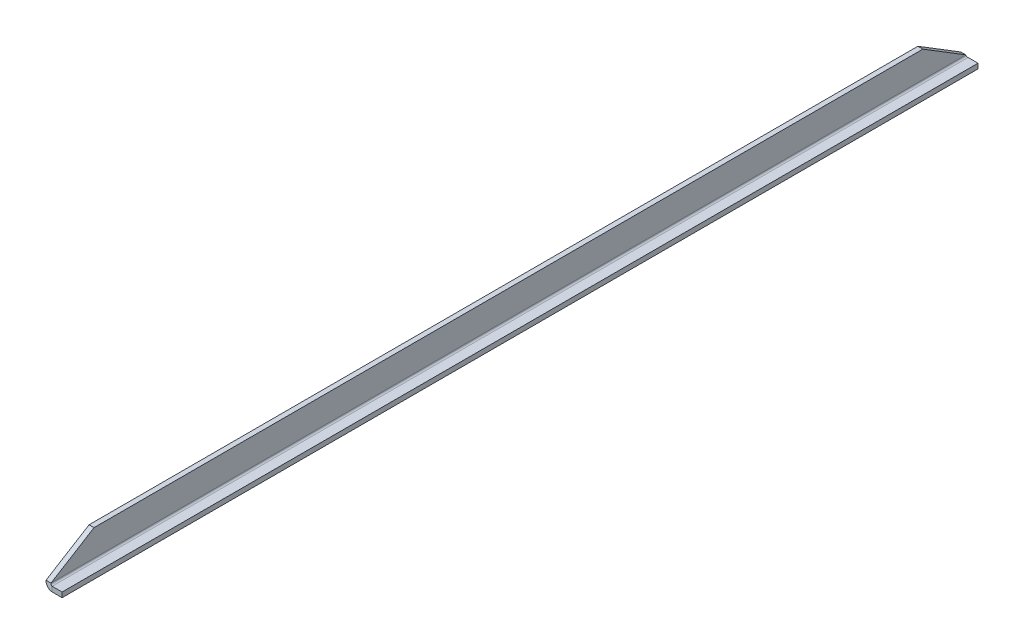
ISO-10303-21;
HEADER;
FILE_DESCRIPTION(('STEP AP214'),'2;1');
FILE_NAME('part.step','',(''),(''),'','','');
FILE_SCHEMA(('AUTOMOTIVE_DESIGN { 1 0 10303 214 1 1 1 1 }'));
ENDSEC;
DATA;
#1=APPLICATION_CONTEXT('core data for automotive mechanical design processes');
#2=APPLICATION_PROTOCOL_DEFINITION('international standard','automotive_design',2000,#1);
#3=PRODUCT_CONTEXT('',#1,'mechanical');
#4=PRODUCT('Part','Part','',(#3));
#5=PRODUCT_RELATED_PRODUCT_CATEGORY('part','',(#4));
#6=PRODUCT_DEFINITION_FORMATION('','',#4);
#7=PRODUCT_DEFINITION_CONTEXT('part definition',#1,'design');
#8=PRODUCT_DEFINITION('design','',#6,#7);
#9=PRODUCT_DEFINITION_SHAPE('','',#8);
#10=(LENGTH_UNIT() NAMED_UNIT(*) SI_UNIT(.MILLI.,.METRE.));
#11=(NAMED_UNIT(*) PLANE_ANGLE_UNIT() SI_UNIT($,.RADIAN.));
#12=(NAMED_UNIT(*) SI_UNIT($,.STERADIAN.) SOLID_ANGLE_UNIT());
#13=UNCERTAINTY_MEASURE_WITH_UNIT(LENGTH_MEASURE(1.E-05),#10,'distance_accuracy_value','');
#14=(GEOMETRIC_REPRESENTATION_CONTEXT(3) GLOBAL_UNCERTAINTY_ASSIGNED_CONTEXT((#13)) GLOBAL_UNIT_ASSIGNED_CONTEXT((#10,
#11,#12)) REPRESENTATION_CONTEXT('',''));
#15=CARTESIAN_POINT('',(0.,0.,0.));
#16=DIRECTION('',(0.,0.,1.));
#17=DIRECTION('',(1.,0.,0.));
#18=AXIS2_PLACEMENT_3D('',#15,#16,#17);
#19=CARTESIAN_POINT('',(-1167.,-730.000000000004,579.999999999999));
#20=DIRECTION('',(0.,1.,0.));
#21=DIRECTION('',(-1.,0.,0.));
#22=AXIS2_PLACEMENT_3D('',#19,#20,#21);
#23=PLANE('',#22);
#24=DIRECTION('',(0.,0.,1.));
#25=VECTOR('',#24,1.);
#26=CARTESIAN_POINT('',(-1160.,-730.000000000004,579.999999999999));
#27=LINE('',#26,#25);
#28=CARTESIAN_POINT('',(-1160.,-730.000000000003,856.292893218813));
#29=VERTEX_POINT('',#28);
#30=CARTESIAN_POINT('',(-1160.,-730.000000000004,303.707106781185));
#31=VERTEX_POINT('',#30);
#32=EDGE_CURVE('E203',#29,#31,#27,.F.);
#33=ORIENTED_EDGE('',*,*,#32,.F.);
#34=DIRECTION('',(-1.,0.,0.));
#35=VECTOR('',#34,1.);
#36=CARTESIAN_POINT('',(-1167.,-730.000000000003,856.292893218813));
#37=LINE('',#36,#35);
#38=CARTESIAN_POINT('',(-1166.,-730.000000000001,856.292893218813));
#39=VERTEX_POINT('',#38);
#40=EDGE_CURVE('E394',#39,#29,#37,.F.);
#41=ORIENTED_EDGE('',*,*,#40,.F.);
#42=DIRECTION('',(0.,0.,1.));
#43=VECTOR('',#42,1.);
#44=CARTESIAN_POINT('',(-1166.,-730.000000000003,856.292893218813));
#45=LINE('',#44,#43);
#46=CARTESIAN_POINT('',(-1166.,-730.000000000032,303.707106781185));
#47=VERTEX_POINT('',#46);
#48=EDGE_CURVE('E178',#47,#39,#45,.T.);
#49=ORIENTED_EDGE('',*,*,#48,.F.);
#50=DIRECTION('',(-1.,0.,0.));
#51=VECTOR('',#50,1.);
#52=CARTESIAN_POINT('',(-1167.,-730.000000000004,303.707106781185));
#53=LINE('',#52,#51);
#54=EDGE_CURVE('E400',#31,#47,#53,.T.);
#55=ORIENTED_EDGE('',*,*,#54,.F.);
#56=EDGE_LOOP('',(#33,#41,#49,#55));
#57=FACE_BOUND('',#56,.T.);
#58=ADVANCED_FACE('F59',(#57),#23,.F.);
#59=CARTESIAN_POINT('',(-1167.,378.236719210667,856.29289321881));
#60=DIRECTION('',(0.,0.,-1.));
#61=DIRECTION('',(-1.,0.,0.));
#62=AXIS2_PLACEMENT_3D('',#59,#60,#61);
#63=PLANE('',#62);
#64=CARTESIAN_POINT('',(-1166.,-730.000000000002,856.292893218813));
#65=CARTESIAN_POINT('',(-1166.,-727.000000000001,856.292893218813));
#66=B_SPLINE_CURVE_WITH_KNOTS('',1,(#64,#65),.UNSPECIFIED.,.F.,.F.,(2,2),(0.,1.),.UNSPECIFIED.);
#67=CARTESIAN_POINT('',(-1166.,-727.000000000003,856.292893218813));
#68=VERTEX_POINT('',#67);
#69=EDGE_CURVE('E413',#68,#39,#66,.F.);
#70=ORIENTED_EDGE('',*,*,#69,.T.);
#71=ORIENTED_EDGE('',*,*,#40,.T.);
#72=DIRECTION('',(0.,-1.,0.));
#73=VECTOR('',#72,1.);
#74=CARTESIAN_POINT('',(-1160.,378.236719210667,856.29289321881));
#75=LINE('',#74,#73);
#76=CARTESIAN_POINT('',(-1160.,-727.000000000001,856.292893218813));
#77=VERTEX_POINT('',#76);
#78=EDGE_CURVE('E14',#77,#29,#75,.T.);
#79=ORIENTED_EDGE('',*,*,#78,.F.);
#80=DIRECTION('',(-1.,0.,0.));
#81=VECTOR('',#80,1.);
#82=CARTESIAN_POINT('',(-1167.,-727.000000000003,856.292893218813));
#83=LINE('',#82,#81);
#84=EDGE_CURVE('E404',#68,#77,#83,.F.);
#85=ORIENTED_EDGE('',*,*,#84,.F.);
#86=EDGE_LOOP('',(#70,#71,#79,#85));
#87=FACE_BOUND('',#86,.T.);
#88=ADVANCED_FACE('F61',(#87),#63,.F.);
#89=CARTESIAN_POINT('',(-1160.,378.236719210665,299.999999999996));
#90=DIRECTION('',(1.,0.,0.));
#91=DIRECTION('',(0.,0.,-1.));
#92=AXIS2_PLACEMENT_3D('',#89,#90,#91);
#93=PLANE('',#92);
#94=ORIENTED_EDGE('',*,*,#32,.T.);
#95=DIRECTION('',(0.,-1.,0.));
#96=VECTOR('',#95,1.);
#97=CARTESIAN_POINT('',(-1160.,378.236719210665,303.707106781182));
#98=LINE('',#97,#96);
#99=CARTESIAN_POINT('',(-1160.,-727.000000000004,303.707106781185));
#100=VERTEX_POINT('',#99);
#101=EDGE_CURVE('E71',#100,#31,#98,.T.);
#102=ORIENTED_EDGE('',*,*,#101,.F.);
#103=DIRECTION('',(0.,0.,1.));
#104=VECTOR('',#103,1.);
#105=CARTESIAN_POINT('',(-1160.,-727.000000000004,299.999999999998));
#106=LINE('',#105,#104);
#107=EDGE_CURVE('E80',#100,#77,#106,.T.);
#108=ORIENTED_EDGE('',*,*,#107,.T.);
#109=ORIENTED_EDGE('',*,*,#78,.T.);
#110=EDGE_LOOP('',(#94,#102,#108,#109));
#111=FACE_BOUND('',#110,.T.);
#112=ADVANCED_FACE('F443',(#111),#93,.T.);
#113=CARTESIAN_POINT('',(-1167.,378.236719210664,303.707106781182));
#114=DIRECTION('',(0.,0.,-1.));
#115=DIRECTION('',(-1.,0.,0.));
#116=AXIS2_PLACEMENT_3D('',#113,#114,#115);
#117=PLANE('',#116);
#118=ORIENTED_EDGE('',*,*,#54,.T.);
#119=CARTESIAN_POINT('',(-1166.,-727.000000000005,303.707106781185));
#120=CARTESIAN_POINT('',(-1166.,-730.000000000005,303.707106781185));
#121=B_SPLINE_CURVE_WITH_KNOTS('',1,(#119,#120),.UNSPECIFIED.,.F.,.F.,(2,2),(0.,1.),.UNSPECIFIED.);
#122=CARTESIAN_POINT('',(-1166.,-727.000000000032,303.707106781185));
#123=VERTEX_POINT('',#122);
#124=EDGE_CURVE('E416',#123,#47,#121,.T.);
#125=ORIENTED_EDGE('',*,*,#124,.F.);
#126=DIRECTION('',(-1.,0.,0.));
#127=VECTOR('',#126,1.);
#128=CARTESIAN_POINT('',(-1167.,-727.000000000004,303.707106781185));
#129=LINE('',#128,#127);
#130=EDGE_CURVE('E90',#123,#100,#129,.F.);
#131=ORIENTED_EDGE('',*,*,#130,.T.);
#132=ORIENTED_EDGE('',*,*,#101,.T.);
#133=EDGE_LOOP('',(#118,#125,#131,#132));
#134=FACE_BOUND('',#133,.T.);
#135=ADVANCED_FACE('F433',(#134),#117,.T.);
#136=CARTESIAN_POINT('',(-1167.,-727.000000000004,579.999999999999));
#137=DIRECTION('',(0.,1.,0.));
#138=DIRECTION('',(-1.,0.,0.));
#139=AXIS2_PLACEMENT_3D('',#136,#137,#138);
#140=PLANE('',#139);
#141=ORIENTED_EDGE('',*,*,#84,.T.);
#142=ORIENTED_EDGE('',*,*,#107,.F.);
#143=ORIENTED_EDGE('',*,*,#130,.F.);
#144=DIRECTION('',(0.,0.,1.));
#145=VECTOR('',#144,1.);
#146=CARTESIAN_POINT('',(-1166.,-727.000000000003,856.292893218813));
#147=LINE('',#146,#145);
#148=EDGE_CURVE('E342',#123,#68,#147,.T.);
#149=ORIENTED_EDGE('',*,*,#148,.T.);
#150=EDGE_LOOP('',(#141,#142,#143,#149));
#151=FACE_BOUND('',#150,.T.);
#152=ADVANCED_FACE('F442',(#151),#140,.T.);
#153=CARTESIAN_POINT('',(-62.5363292529752,-710.,829.999999999999));
#154=DIRECTION('',(0.,-1.,0.));
#155=DIRECTION('',(1.,0.,0.));
#156=AXIS2_PLACEMENT_3D('',#153,#154,#155);
#157=PLANE('',#156);
#158=DIRECTION('',(0.,0.,1.));
#159=VECTOR('',#158,1.);
#160=CARTESIAN_POINT('',(-1170.,-710.,579.999999999999));
#161=LINE('',#160,#159);
#162=CARTESIAN_POINT('',(-1170.,-710.,829.999999999999));
#163=VERTEX_POINT('',#162);
#164=CARTESIAN_POINT('',(-1170.,-710.,329.999999999999));
#165=VERTEX_POINT('',#164);
#166=EDGE_CURVE('E227',#163,#165,#161,.F.);
#167=ORIENTED_EDGE('',*,*,#166,.F.);
#168=DIRECTION('',(-1.,0.,0.));
#169=VECTOR('',#168,1.);
#170=CARTESIAN_POINT('',(-62.5363292529752,-710.,829.999999999999));
#171=LINE('',#170,#169);
#172=CARTESIAN_POINT('',(-1167.,-710.,829.999999999999));
#173=VERTEX_POINT('',#172);
#174=EDGE_CURVE('E196',#173,#163,#171,.T.);
#175=ORIENTED_EDGE('',*,*,#174,.F.);
#176=DIRECTION('',(0.,0.,1.));
#177=VECTOR('',#176,1.);
#178=CARTESIAN_POINT('',(-1167.,-710.,829.999999999999));
#179=LINE('',#178,#177);
#180=CARTESIAN_POINT('',(-1167.,-710.,329.999999999999));
#181=VERTEX_POINT('',#180);
#182=EDGE_CURVE('E221',#181,#173,#179,.T.);
#183=ORIENTED_EDGE('',*,*,#182,.F.);
#184=DIRECTION('',(-1.,0.,0.));
#185=VECTOR('',#184,1.);
#186=CARTESIAN_POINT('',(-62.5363292529748,-710.,329.999999999998));
#187=LINE('',#186,#185);
#188=EDGE_CURVE('E165',#181,#165,#187,.T.);
#189=ORIENTED_EDGE('',*,*,#188,.T.);
#190=EDGE_LOOP('',(#167,#175,#183,#189));
#191=FACE_BOUND('',#190,.T.);
#192=ADVANCED_FACE('F474',(#191),#157,.F.);
#193=CARTESIAN_POINT('',(-1167.,-710.,329.999999999999));
#194=DIRECTION('',(1.,0.,0.));
#195=DIRECTION('',(0.,0.,-1.));
#196=AXIS2_PLACEMENT_3D('',#193,#194,#195);
#197=PLANE('',#196);
#198=DIRECTION('',(0.,-0.524097425664204,-0.851658316704624));
#199=VECTOR('',#198,1.);
#200=CARTESIAN_POINT('',(-1167.,-381.416309013001,863.948497854056));
#201=LINE('',#200,#199);
#202=CARTESIAN_POINT('',(-1167.,-726.000000000004,304.));
#203=VERTEX_POINT('',#202);
#204=EDGE_CURVE('E337',#181,#203,#201,.T.);
#205=ORIENTED_EDGE('',*,*,#204,.F.);
#206=ORIENTED_EDGE('',*,*,#182,.T.);
#207=DIRECTION('',(0.,-0.524097425664304,0.851658316704563));
#208=VECTOR('',#207,1.);
#209=CARTESIAN_POINT('',(-1167.,-381.416309012905,296.051502145927));
#210=LINE('',#209,#208);
#211=CARTESIAN_POINT('',(-1167.,-726.000000000001,855.999999999999));
#212=VERTEX_POINT('',#211);
#213=EDGE_CURVE('E226',#173,#212,#210,.T.);
#214=ORIENTED_EDGE('',*,*,#213,.T.);
#215=DIRECTION('',(0.,0.,1.));
#216=VECTOR('',#215,1.);
#217=CARTESIAN_POINT('',(-1167.,-726.000000000003,579.999999999999));
#218=LINE('',#217,#216);
#219=EDGE_CURVE('E166',#203,#212,#218,.T.);
#220=ORIENTED_EDGE('',*,*,#219,.F.);
#221=EDGE_LOOP('',(#205,#206,#214,#220));
#222=FACE_BOUND('',#221,.T.);
#223=ADVANCED_FACE('F345',(#222),#197,.T.);
#224=CARTESIAN_POINT('',(-62.5363292529748,-381.416309013001,863.948497854056));
#225=DIRECTION('',(0.,0.851658316704624,-0.524097425664204));
#226=DIRECTION('',(0.,0.524097425664204,0.851658316704624));
#227=AXIS2_PLACEMENT_3D('',#224,#225,#226);
#228=PLANE('',#227);
#229=CARTESIAN_POINT('',(-1170.,-726.000000000004,304.));
#230=CARTESIAN_POINT('',(-1167.,-726.000000000004,304.));
#231=B_SPLINE_CURVE_WITH_KNOTS('',1,(#229,#230),.UNSPECIFIED.,.F.,.F.,(2,2),(0.,1.),.UNSPECIFIED.);
#232=CARTESIAN_POINT('',(-1170.,-726.000000000004,304.000000000001));
#233=VERTEX_POINT('',#232);
#234=EDGE_CURVE('E324',#203,#233,#231,.F.);
#235=ORIENTED_EDGE('',*,*,#234,.T.);
#236=DIRECTION('',(0.,-0.524097425664204,-0.851658316704624));
#237=VECTOR('',#236,1.);
#238=CARTESIAN_POINT('',(-1170.,-381.416309013001,863.948497854056));
#239=LINE('',#238,#237);
#240=EDGE_CURVE('E189',#165,#233,#239,.T.);
#241=ORIENTED_EDGE('',*,*,#240,.F.);
#242=ORIENTED_EDGE('',*,*,#188,.F.);
#243=ORIENTED_EDGE('',*,*,#204,.T.);
#244=EDGE_LOOP('',(#235,#241,#242,#243));
#245=FACE_BOUND('',#244,.T.);
#246=ADVANCED_FACE('F350',(#245),#228,.T.);
#247=CARTESIAN_POINT('',(-1170.,80.0000000000003,579.999999999999));
#248=DIRECTION('',(-1.,0.,0.));
#249=DIRECTION('',(0.,0.,1.));
#250=AXIS2_PLACEMENT_3D('',#247,#248,#249);
#251=PLANE('',#250);
#252=ORIENTED_EDGE('',*,*,#166,.T.);
#253=ORIENTED_EDGE('',*,*,#240,.T.);
#254=DIRECTION('',(0.,0.,1.));
#255=VECTOR('',#254,1.);
#256=CARTESIAN_POINT('',(-1170.,-725.999999999997,579.999999999999));
#257=LINE('',#256,#255);
#258=CARTESIAN_POINT('',(-1170.,-726.000000000001,855.999999999999));
#259=VERTEX_POINT('',#258);
#260=EDGE_CURVE('E176',#233,#259,#257,.T.);
#261=ORIENTED_EDGE('',*,*,#260,.T.);
#262=DIRECTION('',(0.,-0.524097425664304,0.851658316704563));
#263=VECTOR('',#262,1.);
#264=CARTESIAN_POINT('',(-1170.,-381.416309012905,296.051502145927));
#265=LINE('',#264,#263);
#266=EDGE_CURVE('E186',#163,#259,#265,.T.);
#267=ORIENTED_EDGE('',*,*,#266,.F.);
#268=EDGE_LOOP('',(#252,#253,#261,#267));
#269=FACE_BOUND('',#268,.T.);
#270=ADVANCED_FACE('F185',(#269),#251,.T.);
#271=CARTESIAN_POINT('',(-62.5363292529748,-381.416309012905,296.051502145926));
#272=DIRECTION('',(0.,-0.851658316704563,-0.524097425664304));
#273=DIRECTION('',(0.,0.524097425664304,-0.851658316704563));
#274=AXIS2_PLACEMENT_3D('',#271,#272,#273);
#275=PLANE('',#274);
#276=ORIENTED_EDGE('',*,*,#266,.T.);
#277=CARTESIAN_POINT('',(-1167.,-726.000000000001,855.999999999999));
#278=CARTESIAN_POINT('',(-1170.,-726.000000000001,855.999999999999));
#279=B_SPLINE_CURVE_WITH_KNOTS('',1,(#277,#278),.UNSPECIFIED.,.F.,.F.,(2,2),(0.,1.),.UNSPECIFIED.);
#280=EDGE_CURVE('E149',#212,#259,#279,.T.);
#281=ORIENTED_EDGE('',*,*,#280,.F.);
#282=ORIENTED_EDGE('',*,*,#213,.F.);
#283=ORIENTED_EDGE('',*,*,#174,.T.);
#284=EDGE_LOOP('',(#276,#281,#282,#283));
#285=FACE_BOUND('',#284,.T.);
#286=ADVANCED_FACE('F194',(#285),#275,.F.);
#287=CARTESIAN_POINT('',(-1170.,-726.000000000004,304.));
#288=CARTESIAN_POINT('',(-1170.,-726.523692974342,303.975587840653));
#289=CARTESIAN_POINT('',(-1169.89589070667,-727.046991537441,303.951184463531));
#290=CARTESIAN_POINT('',(-1169.49514555342,-728.014475921487,303.902368927062));
#291=CARTESIAN_POINT('',(-1169.19866736959,-728.458186879903,303.877961158827));
#292=CARTESIAN_POINT('',(-1168.4581868799,-729.198667369596,303.829145622358));
#293=CARTESIAN_POINT('',(-1168.01447592149,-729.49514555342,303.804737854124));
#294=CARTESIAN_POINT('',(-1167.04699153744,-729.895890706677,303.755922317654));
#295=CARTESIAN_POINT('',(-1166.52369297434,-730.000000000004,303.731518940532));
#296=CARTESIAN_POINT('',(-1166.,-730.000000000005,303.707106781185));
#297=CARTESIAN_POINT('',(-1167.,-726.000000000004,304.));
#298=CARTESIAN_POINT('',(-1167.,-726.13092250178,303.975587978972));
#299=CARTESIAN_POINT('',(-1166.97397267667,-726.261747884363,303.951184463531));
#300=CARTESIAN_POINT('',(-1166.87378638835,-726.503618980375,303.902368927062));
#301=CARTESIAN_POINT('',(-1166.7996668424,-726.614546719979,303.877961158827));
#302=CARTESIAN_POINT('',(-1166.61454671998,-726.799666842402,303.829145622358));
#303=CARTESIAN_POINT('',(-1166.50361898037,-726.873786388358,303.804737854124));
#304=CARTESIAN_POINT('',(-1166.26174788436,-726.973972676672,303.755922317654));
#305=CARTESIAN_POINT('',(-1166.13092250178,-727.000000000004,303.731518802213));
#306=CARTESIAN_POINT('',(-1166.,-727.000000000005,303.707106781185));
#307=B_SPLINE_SURFACE_WITH_KNOTS('',1,3,((#287,#288,#289,#290,#291,#292,#293,#294,#295,#296),
(#297,#298,#299,#300,#301,#302,#303,#304,#305,#306)),.UNSPECIFIED.,.F.,.F.,.F.,(2,2),(4,2,2,2,
4),(0.,1.),(0.,0.25,0.5,0.75,1.),.UNSPECIFIED.);
#308=CARTESIAN_POINT('',(-1167.,-726.000000000004,304.));
#309=CARTESIAN_POINT('',(-1167.,-726.13092250178,303.975587978972));
#310=CARTESIAN_POINT('',(-1166.97397267667,-726.261747884363,303.951184463531));
#311=CARTESIAN_POINT('',(-1166.87378638835,-726.503618980375,303.902368927062));
#312=CARTESIAN_POINT('',(-1166.7996668424,-726.614546719979,303.877961158827));
#313=CARTESIAN_POINT('',(-1166.61454671998,-726.799666842402,303.829145622358));
#314=CARTESIAN_POINT('',(-1166.50361898037,-726.873786388358,303.804737854124));
#315=CARTESIAN_POINT('',(-1166.26174788436,-726.973972676672,303.755922317654));
#316=CARTESIAN_POINT('',(-1166.13092250178,-727.000000000004,303.731518802213));
#317=CARTESIAN_POINT('',(-1166.,-727.000000000005,303.707106781185));
#318=B_SPLINE_CURVE_WITH_KNOTS('',3,(#308,#309,#310,#311,#312,#313,#314,#315,#316,#317),
.UNSPECIFIED.,.F.,.F.,(4,2,2,2,4),(0.,0.25,0.5,0.75,1.),.UNSPECIFIED.);
#319=EDGE_CURVE('E333',#203,#123,#318,.T.);
#320=CARTESIAN_POINT('',(-1166.,-730.000000000005,303.707106781185));
#321=CARTESIAN_POINT('',(-1166.52369297434,-730.000000000004,303.731518940532));
#322=CARTESIAN_POINT('',(-1167.04699153744,-729.895890706677,303.755922317654));
#323=CARTESIAN_POINT('',(-1168.01447592149,-729.49514555342,303.804737854124));
#324=CARTESIAN_POINT('',(-1168.4581868799,-729.198667369596,303.829145622358));
#325=CARTESIAN_POINT('',(-1169.19866736959,-728.458186879903,303.877961158827));
#326=CARTESIAN_POINT('',(-1169.49514555342,-728.014475921487,303.902368927062));
#327=CARTESIAN_POINT('',(-1169.89589070667,-727.046991537441,303.951184463531));
#328=CARTESIAN_POINT('',(-1170.,-726.523692974342,303.975587840653));
#329=CARTESIAN_POINT('',(-1170.,-726.000000000004,304.));
#330=B_SPLINE_CURVE_WITH_KNOTS('',3,(#320,#321,#322,#323,#324,#325,#326,#327,#328,#329),
.UNSPECIFIED.,.F.,.F.,(4,2,2,2,4),(0.,0.25,0.5,0.75,1.),.UNSPECIFIED.);
#331=EDGE_CURVE('E180',#233,#47,#330,.F.);
#332=ORIENTED_EDGE('',*,*,#234,.F.);
#333=ORIENTED_EDGE('',*,*,#319,.T.);
#334=ORIENTED_EDGE('',*,*,#124,.T.);
#335=ORIENTED_EDGE('',*,*,#331,.F.);
#336=EDGE_LOOP('',(#332,#333,#334,#335));
#337=FACE_BOUND('',#336,.T.);
#338=ADVANCED_FACE('F284',(#337),#307,.T.);
#339=CARTESIAN_POINT('',(-1166.,-730.000000000002,856.292893218813));
#340=CARTESIAN_POINT('',(-1166.52369297434,-730.000000000002,856.268481059466));
#341=CARTESIAN_POINT('',(-1167.04699153744,-729.895890706675,856.244077682344));
#342=CARTESIAN_POINT('',(-1168.01447592148,-729.495145553419,856.195262145875));
#343=CARTESIAN_POINT('',(-1168.4581868799,-729.198667369594,856.17085437764));
#344=CARTESIAN_POINT('',(-1169.19866736959,-728.458186879901,856.122038841171));
#345=CARTESIAN_POINT('',(-1169.49514555342,-728.014475921485,856.097631072937));
#346=CARTESIAN_POINT('',(-1169.89589070667,-727.046991537438,856.048815536468));
#347=CARTESIAN_POINT('',(-1170.,-726.523692974339,856.024412159346));
#348=CARTESIAN_POINT('',(-1170.,-726.000000000001,855.999999999999));
#349=CARTESIAN_POINT('',(-1166.,-727.000000000001,856.292893218813));
#350=CARTESIAN_POINT('',(-1166.13092250178,-727.000000000001,856.268481197785));
#351=CARTESIAN_POINT('',(-1166.26174788436,-726.97397267667,856.244077682344));
#352=CARTESIAN_POINT('',(-1166.50361898037,-726.873786388356,856.195262145875));
#353=CARTESIAN_POINT('',(-1166.61454671998,-726.7996668424,856.17085437764));
#354=CARTESIAN_POINT('',(-1166.7996668424,-726.614546719976,856.122038841171));
#355=CARTESIAN_POINT('',(-1166.87378638836,-726.503618980372,856.097631072937));
#356=CARTESIAN_POINT('',(-1166.97397267667,-726.261747884361,856.048815536468));
#357=CARTESIAN_POINT('',(-1167.,-726.130922501776,856.024412021027));
#358=CARTESIAN_POINT('',(-1167.,-726.000000000001,855.999999999999));
#359=B_SPLINE_SURFACE_WITH_KNOTS('',1,3,((#339,#340,#341,#342,#343,#344,#345,#346,#347,#348),
(#349,#350,#351,#352,#353,#354,#355,#356,#357,#358)),.UNSPECIFIED.,.F.,.F.,.F.,(2,2),(4,2,2,2,
4),(0.,1.),(0.,0.25,0.5,0.75,1.),.UNSPECIFIED.);
#360=CARTESIAN_POINT('',(-1166.,-727.000000000001,856.292893218813));
#361=CARTESIAN_POINT('',(-1166.13092250178,-727.000000000001,856.268481197785));
#362=CARTESIAN_POINT('',(-1166.26174788436,-726.97397267667,856.244077682344));
#363=CARTESIAN_POINT('',(-1166.50361898037,-726.873786388356,856.195262145875));
#364=CARTESIAN_POINT('',(-1166.61454671998,-726.7996668424,856.17085437764));
#365=CARTESIAN_POINT('',(-1166.7996668424,-726.614546719976,856.122038841171));
#366=CARTESIAN_POINT('',(-1166.87378638836,-726.503618980372,856.097631072937));
#367=CARTESIAN_POINT('',(-1166.97397267667,-726.261747884361,856.048815536468));
#368=CARTESIAN_POINT('',(-1167.,-726.130922501776,856.024412021027));
#369=CARTESIAN_POINT('',(-1167.,-726.000000000001,855.999999999999));
#370=B_SPLINE_CURVE_WITH_KNOTS('',3,(#360,#361,#362,#363,#364,#365,#366,#367,#368,#369),
.UNSPECIFIED.,.F.,.F.,(4,2,2,2,4),(0.,0.25,0.5,0.75,1.),.UNSPECIFIED.);
#371=EDGE_CURVE('E157',#68,#212,#370,.T.);
#372=CARTESIAN_POINT('',(-1170.,-726.000000000001,855.999999999999));
#373=CARTESIAN_POINT('',(-1170.,-726.523692974339,856.024412159346));
#374=CARTESIAN_POINT('',(-1169.89589070667,-727.046991537438,856.048815536468));
#375=CARTESIAN_POINT('',(-1169.49514555342,-728.014475921485,856.097631072937));
#376=CARTESIAN_POINT('',(-1169.19866736959,-728.458186879901,856.122038841171));
#377=CARTESIAN_POINT('',(-1168.4581868799,-729.198667369594,856.17085437764));
#378=CARTESIAN_POINT('',(-1168.01447592148,-729.495145553419,856.195262145875));
#379=CARTESIAN_POINT('',(-1167.04699153744,-729.895890706675,856.244077682344));
#380=CARTESIAN_POINT('',(-1166.52369297434,-730.000000000002,856.268481059466));
#381=CARTESIAN_POINT('',(-1166.,-730.000000000002,856.292893218813));
#382=B_SPLINE_CURVE_WITH_KNOTS('',3,(#372,#373,#374,#375,#376,#377,#378,#379,#380,#381),
.UNSPECIFIED.,.F.,.F.,(4,2,2,2,4),(0.,0.25,0.5,0.75,1.),.UNSPECIFIED.);
#383=EDGE_CURVE('E154',#39,#259,#382,.F.);
#384=ORIENTED_EDGE('',*,*,#371,.T.);
#385=ORIENTED_EDGE('',*,*,#280,.T.);
#386=ORIENTED_EDGE('',*,*,#383,.F.);
#387=ORIENTED_EDGE('',*,*,#69,.F.);
#388=EDGE_LOOP('',(#384,#385,#386,#387));
#389=FACE_BOUND('',#388,.T.);
#390=ADVANCED_FACE('F152',(#389),#359,.T.);
#391=CARTESIAN_POINT('',(-1166.,-725.999999999998,1409.30560216312));
#392=DIRECTION('',(0.,0.,-1.));
#393=DIRECTION('',(0.,1.,0.));
#394=AXIS2_PLACEMENT_3D('',#391,#392,#393);
#395=CYLINDRICAL_SURFACE('',#394,4.00000000000014);
#396=ORIENTED_EDGE('',*,*,#48,.T.);
#397=ORIENTED_EDGE('',*,*,#383,.T.);
#398=ORIENTED_EDGE('',*,*,#260,.F.);
#399=ORIENTED_EDGE('',*,*,#331,.T.);
#400=EDGE_LOOP('',(#396,#397,#398,#399));
#401=FACE_BOUND('',#400,.T.);
#402=ADVANCED_FACE('F174',(#401),#395,.T.);
#403=CARTESIAN_POINT('',(-1166.,-725.999999999998,1409.30560216312));
#404=DIRECTION('',(0.,0.,-1.));
#405=DIRECTION('',(0.,1.,0.));
#406=AXIS2_PLACEMENT_3D('',#403,#404,#405);
#407=CYLINDRICAL_SURFACE('',#406,1.00000000000014);
#408=ORIENTED_EDGE('',*,*,#148,.F.);
#409=ORIENTED_EDGE('',*,*,#319,.F.);
#410=ORIENTED_EDGE('',*,*,#219,.T.);
#411=ORIENTED_EDGE('',*,*,#371,.F.);
#412=EDGE_LOOP('',(#408,#409,#410,#411));
#413=FACE_BOUND('',#412,.T.);
#414=ADVANCED_FACE('F264',(#413),#407,.F.);
#415=CLOSED_SHELL('',(#58,#88,#112,#135,#152,#192,#223,#246,#270,#286,#338,#390,#402,#414));
#416=MANIFOLD_SOLID_BREP('B2',#415);
#417=ADVANCED_BREP_SHAPE_REPRESENTATION('',(#18,#416),#14);
#418=SHAPE_DEFINITION_REPRESENTATION(#9,#417);
ENDSEC;
END-ISO-10303-21;
